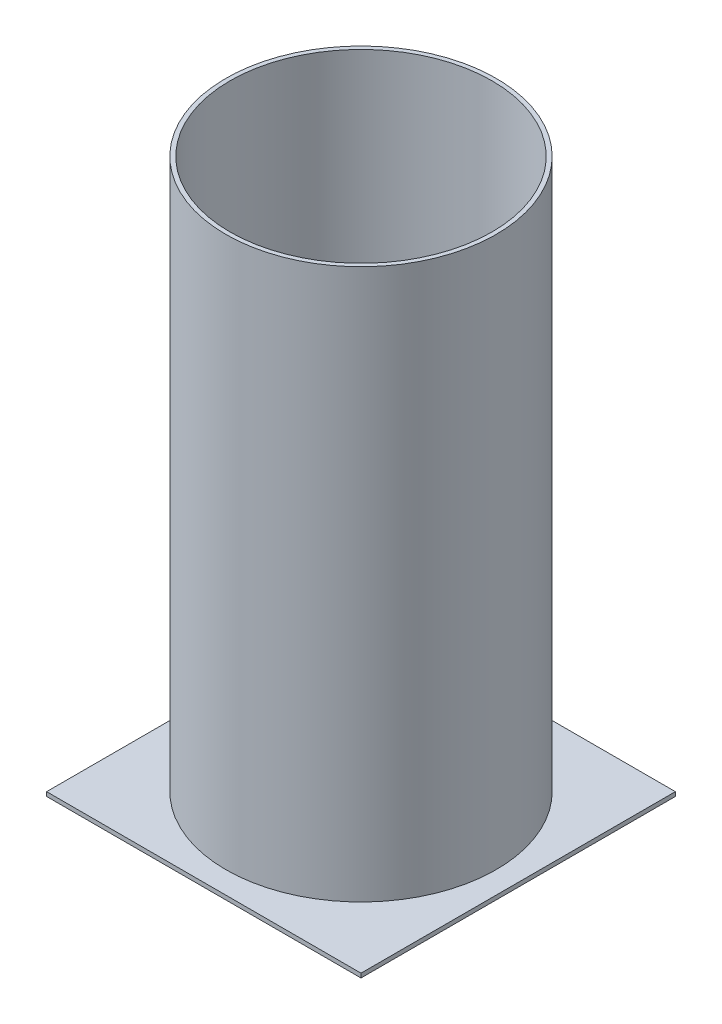
ISO-10303-21;
HEADER;
FILE_DESCRIPTION(('STEP AP214'),'2;1');
FILE_NAME('part.step','',(''),(''),'','','');
FILE_SCHEMA(('AUTOMOTIVE_DESIGN { 1 0 10303 214 1 1 1 1 }'));
ENDSEC;
DATA;
#1=APPLICATION_CONTEXT('core data for automotive mechanical design processes');
#2=APPLICATION_PROTOCOL_DEFINITION('international standard','automotive_design',2000,#1);
#3=PRODUCT_CONTEXT('',#1,'mechanical');
#4=PRODUCT('Part','Part','',(#3));
#5=PRODUCT_RELATED_PRODUCT_CATEGORY('part','',(#4));
#6=PRODUCT_DEFINITION_FORMATION('','',#4);
#7=PRODUCT_DEFINITION_CONTEXT('part definition',#1,'design');
#8=PRODUCT_DEFINITION('design','',#6,#7);
#9=PRODUCT_DEFINITION_SHAPE('','',#8);
#10=(LENGTH_UNIT() NAMED_UNIT(*) SI_UNIT(.MILLI.,.METRE.));
#11=(NAMED_UNIT(*) PLANE_ANGLE_UNIT() SI_UNIT($,.RADIAN.));
#12=(NAMED_UNIT(*) SI_UNIT($,.STERADIAN.) SOLID_ANGLE_UNIT());
#13=UNCERTAINTY_MEASURE_WITH_UNIT(LENGTH_MEASURE(1.E-05),#10,'distance_accuracy_value','');
#14=(GEOMETRIC_REPRESENTATION_CONTEXT(3) GLOBAL_UNCERTAINTY_ASSIGNED_CONTEXT((#13)) GLOBAL_UNIT_ASSIGNED_CONTEXT((#10,
#11,#12)) REPRESENTATION_CONTEXT('',''));
#15=CARTESIAN_POINT('',(0.,0.,0.));
#16=DIRECTION('',(0.,0.,1.));
#17=DIRECTION('',(1.,0.,0.));
#18=AXIS2_PLACEMENT_3D('',#15,#16,#17);
#19=CARTESIAN_POINT('',(300.,4.,-300.));
#20=DIRECTION('',(0.,0.,1.));
#21=DIRECTION('',(1.,0.,0.));
#22=AXIS2_PLACEMENT_3D('',#19,#20,#21);
#23=PLANE('',#22);
#24=DIRECTION('',(-1.,0.,0.));
#25=VECTOR('',#24,1.);
#26=CARTESIAN_POINT('',(300.,0.,-300.));
#27=LINE('',#26,#25);
#28=CARTESIAN_POINT('',(300.,0.,-300.));
#29=VERTEX_POINT('',#28);
#30=CARTESIAN_POINT('',(0.,0.,-300.));
#31=VERTEX_POINT('',#30);
#32=EDGE_CURVE('E105',#29,#31,#27,.T.);
#33=ORIENTED_EDGE('',*,*,#32,.T.);
#34=DIRECTION('',(0.,-1.,0.));
#35=VECTOR('',#34,1.);
#36=CARTESIAN_POINT('',(0.,4.,-300.));
#37=LINE('',#36,#35);
#38=CARTESIAN_POINT('',(0.,4.,-300.));
#39=VERTEX_POINT('',#38);
#40=EDGE_CURVE('E47',#39,#31,#37,.T.);
#41=ORIENTED_EDGE('',*,*,#40,.F.);
#42=DIRECTION('',(-1.,0.,0.));
#43=VECTOR('',#42,1.);
#44=CARTESIAN_POINT('',(300.,4.,-300.));
#45=LINE('',#44,#43);
#46=CARTESIAN_POINT('',(300.,4.,-300.));
#47=VERTEX_POINT('',#46);
#48=EDGE_CURVE('E91',#47,#39,#45,.T.);
#49=ORIENTED_EDGE('',*,*,#48,.F.);
#50=DIRECTION('',(0.,-1.,0.));
#51=VECTOR('',#50,1.);
#52=CARTESIAN_POINT('',(300.,4.,-300.));
#53=LINE('',#52,#51);
#54=EDGE_CURVE('E101',#47,#29,#53,.T.);
#55=ORIENTED_EDGE('',*,*,#54,.T.);
#56=EDGE_LOOP('',(#33,#41,#49,#55));
#57=FACE_BOUND('',#56,.T.);
#58=ADVANCED_FACE('F39',(#57),#23,.F.);
#59=CARTESIAN_POINT('',(0.,4.,-300.));
#60=DIRECTION('',(1.,0.,0.));
#61=DIRECTION('',(0.,0.,-1.));
#62=AXIS2_PLACEMENT_3D('',#59,#60,#61);
#63=PLANE('',#62);
#64=DIRECTION('',(0.,0.,1.));
#65=VECTOR('',#64,1.);
#66=CARTESIAN_POINT('',(0.,0.,-300.));
#67=LINE('',#66,#65);
#68=CARTESIAN_POINT('',(0.,0.,0.));
#69=VERTEX_POINT('',#68);
#70=EDGE_CURVE('E96',#31,#69,#67,.T.);
#71=ORIENTED_EDGE('',*,*,#70,.T.);
#72=DIRECTION('',(0.,-1.,0.));
#73=VECTOR('',#72,1.);
#74=CARTESIAN_POINT('',(0.,4.,0.));
#75=LINE('',#74,#73);
#76=CARTESIAN_POINT('',(0.,4.,0.));
#77=VERTEX_POINT('',#76);
#78=EDGE_CURVE('E94',#77,#69,#75,.T.);
#79=ORIENTED_EDGE('',*,*,#78,.F.);
#80=DIRECTION('',(0.,0.,1.));
#81=VECTOR('',#80,1.);
#82=CARTESIAN_POINT('',(0.,4.,-300.));
#83=LINE('',#82,#81);
#84=EDGE_CURVE('E86',#39,#77,#83,.T.);
#85=ORIENTED_EDGE('',*,*,#84,.F.);
#86=ORIENTED_EDGE('',*,*,#40,.T.);
#87=EDGE_LOOP('',(#71,#79,#85,#86));
#88=FACE_BOUND('',#87,.T.);
#89=ADVANCED_FACE('F95',(#88),#63,.F.);
#90=CARTESIAN_POINT('',(0.,4.,0.));
#91=DIRECTION('',(0.,0.,-1.));
#92=DIRECTION('',(-1.,0.,0.));
#93=AXIS2_PLACEMENT_3D('',#90,#91,#92);
#94=PLANE('',#93);
#95=DIRECTION('',(1.,0.,0.));
#96=VECTOR('',#95,1.);
#97=CARTESIAN_POINT('',(0.,0.,0.));
#98=LINE('',#97,#96);
#99=CARTESIAN_POINT('',(300.,0.,0.));
#100=VERTEX_POINT('',#99);
#101=EDGE_CURVE('E72',#69,#100,#98,.T.);
#102=ORIENTED_EDGE('',*,*,#101,.T.);
#103=DIRECTION('',(0.,-1.,0.));
#104=VECTOR('',#103,1.);
#105=CARTESIAN_POINT('',(300.,4.,0.));
#106=LINE('',#105,#104);
#107=CARTESIAN_POINT('',(300.,4.,0.));
#108=VERTEX_POINT('',#107);
#109=EDGE_CURVE('E97',#108,#100,#106,.T.);
#110=ORIENTED_EDGE('',*,*,#109,.F.);
#111=DIRECTION('',(1.,0.,0.));
#112=VECTOR('',#111,1.);
#113=CARTESIAN_POINT('',(0.,4.,0.));
#114=LINE('',#113,#112);
#115=EDGE_CURVE('E89',#77,#108,#114,.T.);
#116=ORIENTED_EDGE('',*,*,#115,.F.);
#117=ORIENTED_EDGE('',*,*,#78,.T.);
#118=EDGE_LOOP('',(#102,#110,#116,#117));
#119=FACE_BOUND('',#118,.T.);
#120=ADVANCED_FACE('F99',(#119),#94,.F.);
#121=CARTESIAN_POINT('',(300.,4.,0.));
#122=DIRECTION('',(-1.,0.,0.));
#123=DIRECTION('',(0.,0.,1.));
#124=AXIS2_PLACEMENT_3D('',#121,#122,#123);
#125=PLANE('',#124);
#126=DIRECTION('',(0.,0.,-1.));
#127=VECTOR('',#126,1.);
#128=CARTESIAN_POINT('',(300.,0.,0.));
#129=LINE('',#128,#127);
#130=EDGE_CURVE('E78',#100,#29,#129,.T.);
#131=ORIENTED_EDGE('',*,*,#130,.T.);
#132=ORIENTED_EDGE('',*,*,#54,.F.);
#133=DIRECTION('',(0.,0.,-1.));
#134=VECTOR('',#133,1.);
#135=CARTESIAN_POINT('',(300.,4.,0.));
#136=LINE('',#135,#134);
#137=EDGE_CURVE('E55',#108,#47,#136,.T.);
#138=ORIENTED_EDGE('',*,*,#137,.F.);
#139=ORIENTED_EDGE('',*,*,#109,.T.);
#140=EDGE_LOOP('',(#131,#132,#138,#139));
#141=FACE_BOUND('',#140,.T.);
#142=ADVANCED_FACE('F127',(#141),#125,.F.);
#143=CARTESIAN_POINT('',(0.,4.,0.));
#144=DIRECTION('',(0.,1.,0.));
#145=DIRECTION('',(0.,0.,1.));
#146=AXIS2_PLACEMENT_3D('',#143,#144,#145);
#147=PLANE('',#146);
#148=CARTESIAN_POINT('',(150.,4.,-150.));
#149=DIRECTION('',(0.,1.,0.));
#150=DIRECTION('',(0.,0.,1.));
#151=AXIS2_PLACEMENT_3D('',#148,#149,#150);
#152=CIRCLE('',#151,129.);
#153=CARTESIAN_POINT('',(150.,4.,-21.));
#154=VERTEX_POINT('',#153);
#155=EDGE_CURVE('E234',#154,#154,#152,.T.);
#156=ORIENTED_EDGE('',*,*,#155,.F.);
#157=EDGE_LOOP('',(#156));
#158=FACE_BOUND('',#157,.T.);
#159=ORIENTED_EDGE('',*,*,#48,.T.);
#160=ORIENTED_EDGE('',*,*,#84,.T.);
#161=ORIENTED_EDGE('',*,*,#115,.T.);
#162=ORIENTED_EDGE('',*,*,#137,.T.);
#163=EDGE_LOOP('',(#159,#160,#161,#162));
#164=FACE_BOUND('',#163,.T.);
#165=ADVANCED_FACE('F87',(#158,#164),#147,.T.);
#166=CARTESIAN_POINT('',(0.,0.,0.));
#167=DIRECTION('',(0.,1.,0.));
#168=DIRECTION('',(0.,0.,1.));
#169=AXIS2_PLACEMENT_3D('',#166,#167,#168);
#170=PLANE('',#169);
#171=ORIENTED_EDGE('',*,*,#32,.F.);
#172=ORIENTED_EDGE('',*,*,#130,.F.);
#173=ORIENTED_EDGE('',*,*,#101,.F.);
#174=ORIENTED_EDGE('',*,*,#70,.F.);
#175=EDGE_LOOP('',(#171,#172,#173,#174));
#176=FACE_BOUND('',#175,.T.);
#177=ADVANCED_FACE('F116',(#176),#170,.F.);
#178=CARTESIAN_POINT('',(150.,529.,-150.));
#179=DIRECTION('',(0.,1.,0.));
#180=DIRECTION('',(0.,0.,1.));
#181=AXIS2_PLACEMENT_3D('',#178,#179,#180);
#182=PLANE('',#181);
#183=CARTESIAN_POINT('',(150.,529.,-150.));
#184=DIRECTION('',(0.,1.,0.));
#185=DIRECTION('',(0.,0.,1.));
#186=AXIS2_PLACEMENT_3D('',#183,#184,#185);
#187=CIRCLE('',#186,129.);
#188=CARTESIAN_POINT('',(150.,529.,-21.));
#189=VERTEX_POINT('',#188);
#190=EDGE_CURVE('E108',#189,#189,#187,.T.);
#191=ORIENTED_EDGE('',*,*,#190,.T.);
#192=EDGE_LOOP('',(#191));
#193=FACE_BOUND('',#192,.T.);
#194=CARTESIAN_POINT('',(150.,529.,-150.));
#195=DIRECTION('',(0.,1.,0.));
#196=DIRECTION('',(0.,0.,1.));
#197=AXIS2_PLACEMENT_3D('',#194,#195,#196);
#198=CIRCLE('',#197,125.);
#199=CARTESIAN_POINT('',(150.,529.,-25.0000000000001));
#200=VERTEX_POINT('',#199);
#201=EDGE_CURVE('E232',#200,#200,#198,.T.);
#202=ORIENTED_EDGE('',*,*,#201,.F.);
#203=EDGE_LOOP('',(#202));
#204=FACE_BOUND('',#203,.T.);
#205=ADVANCED_FACE('F118',(#193,#204),#182,.T.);
#206=CARTESIAN_POINT('',(150.,529.,-150.));
#207=DIRECTION('',(0.,-1.,0.));
#208=DIRECTION('',(0.,0.,-1.));
#209=AXIS2_PLACEMENT_3D('',#206,#207,#208);
#210=CYLINDRICAL_SURFACE('',#209,129.);
#211=ORIENTED_EDGE('',*,*,#190,.F.);
#212=EDGE_LOOP('',(#211));
#213=FACE_BOUND('',#212,.T.);
#214=ORIENTED_EDGE('',*,*,#155,.T.);
#215=EDGE_LOOP('',(#214));
#216=FACE_BOUND('',#215,.T.);
#217=ADVANCED_FACE('F124',(#213,#216),#210,.T.);
#218=CARTESIAN_POINT('',(150.,529.,-150.));
#219=DIRECTION('',(0.,-1.,0.));
#220=DIRECTION('',(0.,0.,-1.));
#221=AXIS2_PLACEMENT_3D('',#218,#219,#220);
#222=CYLINDRICAL_SURFACE('',#221,125.);
#223=ORIENTED_EDGE('',*,*,#201,.T.);
#224=EDGE_LOOP('',(#223));
#225=FACE_BOUND('',#224,.T.);
#226=CARTESIAN_POINT('',(150.,4.,-150.));
#227=DIRECTION('',(0.,1.,0.));
#228=DIRECTION('',(0.,0.,1.));
#229=AXIS2_PLACEMENT_3D('',#226,#227,#228);
#230=CIRCLE('',#229,125.);
#231=CARTESIAN_POINT('',(150.,4.,-25.0000000000001));
#232=VERTEX_POINT('',#231);
#233=EDGE_CURVE('E11',#232,#232,#230,.F.);
#234=ORIENTED_EDGE('',*,*,#233,.T.);
#235=EDGE_LOOP('',(#234));
#236=FACE_BOUND('',#235,.T.);
#237=ADVANCED_FACE('F158',(#225,#236),#222,.F.);
#238=ORIENTED_EDGE('',*,*,#233,.F.);
#239=EDGE_LOOP('',(#238));
#240=FACE_BOUND('',#239,.T.);
#241=ADVANCED_FACE('F130',(#240),#147,.T.);
#242=CLOSED_SHELL('',(#58,#89,#120,#142,#165,#177,#205,#217,#237,#241));
#243=MANIFOLD_SOLID_BREP('B2',#242);
#244=ADVANCED_BREP_SHAPE_REPRESENTATION('',(#18,#243),#14);
#245=SHAPE_DEFINITION_REPRESENTATION(#9,#244);
ENDSEC;
END-ISO-10303-21;
